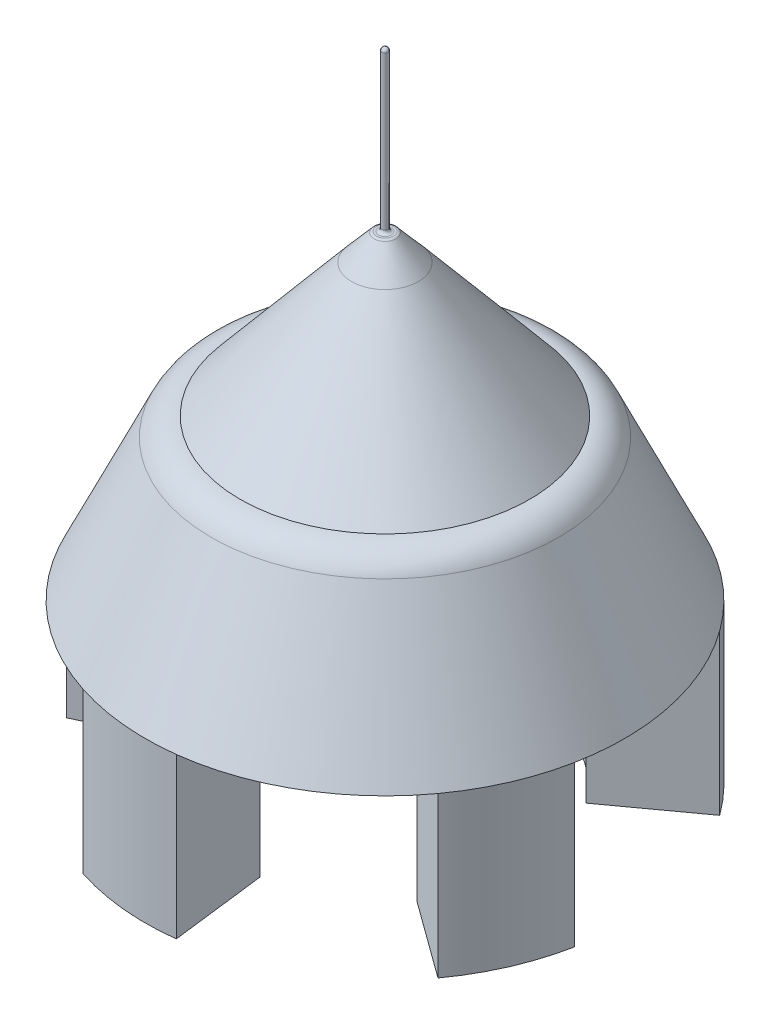
ISO-10303-21;
HEADER;
FILE_DESCRIPTION(('STEP AP214'),'2;1');
FILE_NAME('part.step','',(''),(''),'','','');
FILE_SCHEMA(('AUTOMOTIVE_DESIGN { 1 0 10303 214 1 1 1 1 }'));
ENDSEC;
DATA;
#1=APPLICATION_CONTEXT('core data for automotive mechanical design processes');
#2=APPLICATION_PROTOCOL_DEFINITION('international standard','automotive_design',2000,#1);
#3=PRODUCT_CONTEXT('',#1,'mechanical');
#4=PRODUCT('Part','Part','',(#3));
#5=PRODUCT_RELATED_PRODUCT_CATEGORY('part','',(#4));
#6=PRODUCT_DEFINITION_FORMATION('','',#4);
#7=PRODUCT_DEFINITION_CONTEXT('part definition',#1,'design');
#8=PRODUCT_DEFINITION('design','',#6,#7);
#9=PRODUCT_DEFINITION_SHAPE('','',#8);
#10=(LENGTH_UNIT() NAMED_UNIT(*) SI_UNIT(.MILLI.,.METRE.));
#11=(NAMED_UNIT(*) PLANE_ANGLE_UNIT() SI_UNIT($,.RADIAN.));
#12=(NAMED_UNIT(*) SI_UNIT($,.STERADIAN.) SOLID_ANGLE_UNIT());
#13=UNCERTAINTY_MEASURE_WITH_UNIT(LENGTH_MEASURE(1.E-05),#10,'distance_accuracy_value','');
#14=(GEOMETRIC_REPRESENTATION_CONTEXT(3) GLOBAL_UNCERTAINTY_ASSIGNED_CONTEXT((#13)) GLOBAL_UNIT_ASSIGNED_CONTEXT((#10,
#11,#12)) REPRESENTATION_CONTEXT('',''));
#15=CARTESIAN_POINT('',(0.,0.,0.));
#16=DIRECTION('',(0.,0.,1.));
#17=DIRECTION('',(1.,0.,0.));
#18=AXIS2_PLACEMENT_3D('',#15,#16,#17);
#19=CARTESIAN_POINT('',(0.,0.,0.));
#20=DIRECTION('',(0.,1.,0.));
#21=DIRECTION('',(0.,0.,1.));
#22=AXIS2_PLACEMENT_3D('',#19,#20,#21);
#23=PLANE('',#22);
#24=DIRECTION('',(0.309016994374958,0.,0.95105651629515));
#25=VECTOR('',#24,1.);
#26=CARTESIAN_POINT('',(-23.1762745781219,0.,-71.3292387221362));
#27=LINE('',#26,#25);
#28=CARTESIAN_POINT('',(-23.1762745781219,0.,-71.3292387221362));
#29=VERTEX_POINT('',#28);
#30=CARTESIAN_POINT('',(-13.9057647468731,0.,-42.7975432332817));
#31=VERTEX_POINT('',#30);
#32=EDGE_CURVE('E518',#29,#31,#27,.T.);
#33=ORIENTED_EDGE('',*,*,#32,.F.);
#34=CARTESIAN_POINT('',(0.,0.,0.));
#35=DIRECTION('',(0.,1.,0.));
#36=DIRECTION('',(0.,0.,1.));
#37=AXIS2_PLACEMENT_3D('',#34,#35,#36);
#38=CIRCLE('',#37,75.);
#39=CARTESIAN_POINT('',(36.3607215184746,0.,-65.596478035455));
#40=VERTEX_POINT('',#39);
#41=EDGE_CURVE('E510',#40,#29,#38,.T.);
#42=ORIENTED_EDGE('',*,*,#41,.F.);
#43=DIRECTION('',(0.484809620246328,0.,-0.874619707139401));
#44=VECTOR('',#43,1.);
#45=CARTESIAN_POINT('',(36.3607215184746,0.,-65.596478035455));
#46=LINE('',#45,#44);
#47=CARTESIAN_POINT('',(21.8164329110848,0.,-39.357886821273));
#48=VERTEX_POINT('',#47);
#49=EDGE_CURVE('E208',#48,#40,#46,.T.);
#50=ORIENTED_EDGE('',*,*,#49,.F.);
#51=CARTESIAN_POINT('',(0.,0.,0.));
#52=DIRECTION('',(0.,1.,0.));
#53=DIRECTION('',(0.58778525229248,0.,0.809016994374942));
#54=AXIS2_PLACEMENT_3D('',#51,#52,#53);
#55=CIRCLE('',#54,45.);
#56=CARTESIAN_POINT('',(36.4057647468724,0.,-26.4503363531616));
#57=VERTEX_POINT('',#56);
#58=EDGE_CURVE('E215',#57,#48,#55,.T.);
#59=ORIENTED_EDGE('',*,*,#58,.F.);
#60=DIRECTION('',(-0.809016994374942,0.,0.58778525229248));
#61=VECTOR('',#60,1.);
#62=CARTESIAN_POINT('',(60.6762745781206,0.,-44.083893921936));
#63=LINE('',#62,#61);
#64=CARTESIAN_POINT('',(60.6762745781206,0.,-44.083893921936));
#65=VERTEX_POINT('',#64);
#66=EDGE_CURVE('E198',#65,#57,#63,.T.);
#67=ORIENTED_EDGE('',*,*,#66,.F.);
#68=CARTESIAN_POINT('',(73.6220387585749,0.,14.3106746532404));
#69=VERTEX_POINT('',#68);
#70=EDGE_CURVE('E506',#69,#65,#38,.T.);
#71=ORIENTED_EDGE('',*,*,#70,.F.);
#72=DIRECTION('',(0.981627183447665,0.,0.190808995376538));
#73=VECTOR('',#72,1.);
#74=CARTESIAN_POINT('',(73.6220387585749,0.,14.3106746532404));
#75=LINE('',#74,#73);
#76=CARTESIAN_POINT('',(44.1732232551449,0.,8.5864047919442));
#77=VERTEX_POINT('',#76);
#78=EDGE_CURVE('E232',#77,#69,#75,.T.);
#79=ORIENTED_EDGE('',*,*,#78,.F.);
#80=CARTESIAN_POINT('',(0.,0.,0.));
#81=DIRECTION('',(0.,1.,0.));
#82=DIRECTION('',(-0.587785252292469,0.,0.809016994374951));
#83=AXIS2_PLACEMENT_3D('',#80,#81,#82);
#84=CIRCLE('',#83,45.);
#85=CARTESIAN_POINT('',(36.4057647468728,0.,26.4503363531611));
#86=VERTEX_POINT('',#85);
#87=EDGE_CURVE('E243',#86,#77,#84,.T.);
#88=ORIENTED_EDGE('',*,*,#87,.F.);
#89=DIRECTION('',(-0.809016994374951,0.,-0.587785252292469));
#90=VECTOR('',#89,1.);
#91=CARTESIAN_POINT('',(60.6762745781213,0.,44.0838939219351));
#92=LINE('',#91,#90);
#93=CARTESIAN_POINT('',(60.6762745781213,0.,44.0838939219351));
#94=VERTEX_POINT('',#93);
#95=EDGE_CURVE('E241',#94,#86,#92,.T.);
#96=ORIENTED_EDGE('',*,*,#95,.F.);
#97=CARTESIAN_POINT('',(9.14020075538635,0.,74.4409613730991));
#98=VERTEX_POINT('',#97);
#99=EDGE_CURVE('E504',#98,#94,#38,.T.);
#100=ORIENTED_EDGE('',*,*,#99,.F.);
#101=DIRECTION('',(0.121869343405151,0.,0.992546151641322));
#102=VECTOR('',#101,1.);
#103=CARTESIAN_POINT('',(9.14020075538635,0.,74.4409613730991));
#104=LINE('',#103,#102);
#105=CARTESIAN_POINT('',(5.48412045323183,0.,44.6645768238595));
#106=VERTEX_POINT('',#105);
#107=EDGE_CURVE('E261',#106,#98,#104,.T.);
#108=ORIENTED_EDGE('',*,*,#107,.F.);
#109=CARTESIAN_POINT('',(0.,0.,0.));
#110=DIRECTION('',(0.,1.,0.));
#111=DIRECTION('',(-0.951056516295155,0.,-0.309016994374945));
#112=AXIS2_PLACEMENT_3D('',#109,#110,#111);
#113=CIRCLE('',#112,45.);
#114=CARTESIAN_POINT('',(-13.9057647468725,0.,42.7975432332819));
#115=VERTEX_POINT('',#114);
#116=EDGE_CURVE('E272',#115,#106,#113,.T.);
#117=ORIENTED_EDGE('',*,*,#116,.F.);
#118=DIRECTION('',(0.309016994374945,0.,-0.951056516295155));
#119=VECTOR('',#118,1.);
#120=CARTESIAN_POINT('',(-23.1762745781209,0.,71.3292387221366));
#121=LINE('',#120,#119);
#122=CARTESIAN_POINT('',(-23.1762745781209,0.,71.3292387221366));
#123=VERTEX_POINT('',#122);
#124=EDGE_CURVE('E270',#123,#115,#121,.T.);
#125=ORIENTED_EDGE('',*,*,#124,.F.);
#126=CARTESIAN_POINT('',(-67.9730840277487,0.,31.6963696305525));
#127=VERTEX_POINT('',#126);
#128=EDGE_CURVE('E320',#127,#123,#38,.T.);
#129=ORIENTED_EDGE('',*,*,#128,.F.);
#130=DIRECTION('',(-0.906307787036649,0.,0.4226182617407));
#131=VECTOR('',#130,1.);
#132=CARTESIAN_POINT('',(-67.9730840277487,0.,31.6963696305525));
#133=LINE('',#132,#131);
#134=CARTESIAN_POINT('',(-40.7838504166492,0.,19.0178217783315));
#135=VERTEX_POINT('',#134);
#136=EDGE_CURVE('E290',#135,#127,#133,.T.);
#137=ORIENTED_EDGE('',*,*,#136,.F.);
#138=CARTESIAN_POINT('',(0.,0.,0.));
#139=DIRECTION('',(0.,1.,0.));
#140=DIRECTION('',(0.,0.,-1.));
#141=AXIS2_PLACEMENT_3D('',#138,#139,#140);
#142=CIRCLE('',#141,45.);
#143=CARTESIAN_POINT('',(-45.,0.,0.));
#144=VERTEX_POINT('',#143);
#145=EDGE_CURVE('E299',#144,#135,#142,.T.);
#146=ORIENTED_EDGE('',*,*,#145,.F.);
#147=DIRECTION('',(1.,0.,0.));
#148=VECTOR('',#147,1.);
#149=CARTESIAN_POINT('',(-75.,0.,0.));
#150=LINE('',#149,#148);
#151=CARTESIAN_POINT('',(-75.,0.,0.));
#152=VERTEX_POINT('',#151);
#153=EDGE_CURVE('E285',#152,#144,#150,.T.);
#154=ORIENTED_EDGE('',*,*,#153,.F.);
#155=CARTESIAN_POINT('',(-51.1498770046881,0.,-54.8515276214371));
#156=VERTEX_POINT('',#155);
#157=EDGE_CURVE('E315',#156,#152,#38,.T.);
#158=ORIENTED_EDGE('',*,*,#157,.F.);
#159=DIRECTION('',(-0.681998360062508,0.,-0.731353701619162));
#160=VECTOR('',#159,1.);
#161=CARTESIAN_POINT('',(-51.1498770046881,0.,-54.8515276214371));
#162=LINE('',#161,#160);
#163=CARTESIAN_POINT('',(-30.6899262028128,0.,-32.9109165728623));
#164=VERTEX_POINT('',#163);
#165=EDGE_CURVE('E190',#164,#156,#162,.T.);
#166=ORIENTED_EDGE('',*,*,#165,.F.);
#167=CARTESIAN_POINT('',(0.,0.,0.));
#168=DIRECTION('',(0.,1.,0.));
#169=DIRECTION('',(0.95105651629515,0.,-0.309016994374958));
#170=AXIS2_PLACEMENT_3D('',#167,#168,#169);
#171=CIRCLE('',#170,45.);
#172=EDGE_CURVE('E520',#31,#164,#171,.T.);
#173=ORIENTED_EDGE('',*,*,#172,.F.);
#174=EDGE_LOOP('',(#33,#42,#50,#59,#67,#71,#79,#88,#96,#100,#108,#117,#125,#129,#137,#146,#154,
#158,#166,#173));
#175=FACE_BOUND('',#174,.T.);
#176=ADVANCED_FACE('F35',(#175),#23,.F.);
#177=CARTESIAN_POINT('',(0.,0.,0.));
#178=DIRECTION('',(0.,-1.,0.));
#179=DIRECTION('',(0.,0.,1.));
#180=AXIS2_PLACEMENT_3D('',#177,#178,#179);
#181=CONICAL_SURFACE('',#180,75.,0.436332312998583);
#182=CARTESIAN_POINT('',(0.,44.226182617407,0.));
#183=DIRECTION('',(0.,-1.,0.));
#184=DIRECTION('',(0.,0.,-1.));
#185=AXIS2_PLACEMENT_3D('',#182,#183,#184);
#186=CIRCLE('',#185,54.3769923545416);
#187=CARTESIAN_POINT('',(0.,44.226182617407,-54.3769923545416));
#188=VERTEX_POINT('',#187);
#189=EDGE_CURVE('E323',#188,#188,#186,.T.);
#190=ORIENTED_EDGE('',*,*,#189,.T.);
#191=EDGE_LOOP('',(#190));
#192=FACE_BOUND('',#191,.T.);
#193=EDGE_CURVE('E316',#152,#127,#38,.T.);
#194=ORIENTED_EDGE('',*,*,#193,.T.);
#195=ORIENTED_EDGE('',*,*,#128,.T.);
#196=CARTESIAN_POINT('',(0.,0.,0.));
#197=DIRECTION('',(0.,-1.,0.));
#198=DIRECTION('',(-0.951056516295155,0.,-0.309016994374945));
#199=AXIS2_PLACEMENT_3D('',#196,#197,#198);
#200=CIRCLE('',#199,75.);
#201=EDGE_CURVE('E256',#98,#123,#200,.T.);
#202=ORIENTED_EDGE('',*,*,#201,.F.);
#203=ORIENTED_EDGE('',*,*,#99,.T.);
#204=CARTESIAN_POINT('',(0.,0.,0.));
#205=DIRECTION('',(0.,-1.,0.));
#206=DIRECTION('',(-0.587785252292469,0.,0.809016994374951));
#207=AXIS2_PLACEMENT_3D('',#204,#205,#206);
#208=CIRCLE('',#207,75.);
#209=EDGE_CURVE('E227',#69,#94,#208,.T.);
#210=ORIENTED_EDGE('',*,*,#209,.F.);
#211=ORIENTED_EDGE('',*,*,#70,.T.);
#212=CARTESIAN_POINT('',(0.,0.,0.));
#213=DIRECTION('',(0.,-1.,0.));
#214=DIRECTION('',(0.58778525229248,0.,0.809016994374942));
#215=AXIS2_PLACEMENT_3D('',#212,#213,#214);
#216=CIRCLE('',#215,75.);
#217=EDGE_CURVE('E196',#40,#65,#216,.T.);
#218=ORIENTED_EDGE('',*,*,#217,.F.);
#219=ORIENTED_EDGE('',*,*,#41,.T.);
#220=CARTESIAN_POINT('',(0.,0.,0.));
#221=DIRECTION('',(0.,-1.,0.));
#222=DIRECTION('',(0.95105651629515,0.,-0.309016994374958));
#223=AXIS2_PLACEMENT_3D('',#220,#221,#222);
#224=CIRCLE('',#223,75.);
#225=EDGE_CURVE('E194',#156,#29,#224,.T.);
#226=ORIENTED_EDGE('',*,*,#225,.F.);
#227=ORIENTED_EDGE('',*,*,#157,.T.);
#228=EDGE_LOOP('',(#194,#195,#202,#203,#210,#211,#218,#219,#226,#227));
#229=FACE_BOUND('',#228,.T.);
#230=ADVANCED_FACE('F353',(#192,#229),#181,.T.);
#231=CARTESIAN_POINT('',(0.,40.,0.));
#232=DIRECTION('',(0.,1.,0.));
#233=DIRECTION('',(0.,0.,1.));
#234=AXIS2_PLACEMENT_3D('',#231,#232,#233);
#235=TOROIDAL_SURFACE('',#234,45.3139144841751,10.);
#236=ORIENTED_EDGE('',*,*,#189,.F.);
#237=EDGE_LOOP('',(#236));
#238=FACE_BOUND('',#237,.T.);
#239=CARTESIAN_POINT('',(0.,50.,0.));
#240=DIRECTION('',(0.,1.,0.));
#241=DIRECTION('',(0.,0.,1.));
#242=AXIS2_PLACEMENT_3D('',#239,#240,#241);
#243=CIRCLE('',#242,45.3139144841751);
#244=CARTESIAN_POINT('',(0.,50.,45.3139144841751));
#245=VERTEX_POINT('',#244);
#246=EDGE_CURVE('E319',#245,#245,#243,.T.);
#247=ORIENTED_EDGE('',*,*,#246,.F.);
#248=EDGE_LOOP('',(#247));
#249=FACE_BOUND('',#248,.T.);
#250=ADVANCED_FACE('F359',(#238,#249),#235,.T.);
#251=CARTESIAN_POINT('',(0.,-50.,0.));
#252=DIRECTION('',(0.,1.,0.));
#253=DIRECTION('',(0.,0.,1.));
#254=AXIS2_PLACEMENT_3D('',#251,#252,#253);
#255=CYLINDRICAL_SURFACE('',#254,75.);
#256=ORIENTED_EDGE('',*,*,#193,.F.);
#257=DIRECTION('',(0.,1.,0.));
#258=VECTOR('',#257,1.);
#259=CARTESIAN_POINT('',(-75.,-50.,0.));
#260=LINE('',#259,#258);
#261=CARTESIAN_POINT('',(-75.,-50.,0.));
#262=VERTEX_POINT('',#261);
#263=EDGE_CURVE('E312',#262,#152,#260,.T.);
#264=ORIENTED_EDGE('',*,*,#263,.F.);
#265=CARTESIAN_POINT('',(0.,-50.,0.));
#266=DIRECTION('',(0.,-1.,0.));
#267=DIRECTION('',(0.,0.,-1.));
#268=AXIS2_PLACEMENT_3D('',#265,#266,#267);
#269=CIRCLE('',#268,75.);
#270=CARTESIAN_POINT('',(-67.9730840277487,-50.,31.6963696305525));
#271=VERTEX_POINT('',#270);
#272=EDGE_CURVE('E286',#271,#262,#269,.T.);
#273=ORIENTED_EDGE('',*,*,#272,.F.);
#274=DIRECTION('',(0.,1.,0.));
#275=VECTOR('',#274,1.);
#276=CARTESIAN_POINT('',(-67.9730840277487,-50.,31.6963696305525));
#277=LINE('',#276,#275);
#278=EDGE_CURVE('E296',#271,#127,#277,.T.);
#279=ORIENTED_EDGE('',*,*,#278,.T.);
#280=EDGE_LOOP('',(#256,#264,#273,#279));
#281=FACE_BOUND('',#280,.T.);
#282=ADVANCED_FACE('F363',(#281),#255,.T.);
#283=CARTESIAN_POINT('',(-75.,-50.,0.));
#284=DIRECTION('',(0.,0.,1.));
#285=DIRECTION('',(1.,0.,0.));
#286=AXIS2_PLACEMENT_3D('',#283,#284,#285);
#287=PLANE('',#286);
#288=ORIENTED_EDGE('',*,*,#153,.T.);
#289=DIRECTION('',(0.,1.,0.));
#290=VECTOR('',#289,1.);
#291=CARTESIAN_POINT('',(-45.,-50.,0.));
#292=LINE('',#291,#290);
#293=CARTESIAN_POINT('',(-45.,-50.,0.));
#294=VERTEX_POINT('',#293);
#295=EDGE_CURVE('E309',#294,#144,#292,.T.);
#296=ORIENTED_EDGE('',*,*,#295,.F.);
#297=DIRECTION('',(1.,0.,0.));
#298=VECTOR('',#297,1.);
#299=CARTESIAN_POINT('',(-75.,-50.,0.));
#300=LINE('',#299,#298);
#301=EDGE_CURVE('E289',#262,#294,#300,.T.);
#302=ORIENTED_EDGE('',*,*,#301,.F.);
#303=ORIENTED_EDGE('',*,*,#263,.T.);
#304=EDGE_LOOP('',(#288,#296,#302,#303));
#305=FACE_BOUND('',#304,.T.);
#306=ADVANCED_FACE('F481',(#305),#287,.F.);
#307=CARTESIAN_POINT('',(0.,-50.,0.));
#308=DIRECTION('',(0.,1.,0.));
#309=DIRECTION('',(0.,0.,1.));
#310=AXIS2_PLACEMENT_3D('',#307,#308,#309);
#311=CYLINDRICAL_SURFACE('',#310,45.);
#312=ORIENTED_EDGE('',*,*,#145,.T.);
#313=DIRECTION('',(0.,1.,0.));
#314=VECTOR('',#313,1.);
#315=CARTESIAN_POINT('',(-40.7838504166492,-50.,19.0178217783315));
#316=LINE('',#315,#314);
#317=CARTESIAN_POINT('',(-40.7838504166492,-50.,19.0178217783315));
#318=VERTEX_POINT('',#317);
#319=EDGE_CURVE('E306',#318,#135,#316,.T.);
#320=ORIENTED_EDGE('',*,*,#319,.F.);
#321=CARTESIAN_POINT('',(0.,-50.,0.));
#322=DIRECTION('',(0.,1.,0.));
#323=DIRECTION('',(0.,0.,-1.));
#324=AXIS2_PLACEMENT_3D('',#321,#322,#323);
#325=CIRCLE('',#324,45.);
#326=EDGE_CURVE('E292',#294,#318,#325,.T.);
#327=ORIENTED_EDGE('',*,*,#326,.F.);
#328=ORIENTED_EDGE('',*,*,#295,.T.);
#329=EDGE_LOOP('',(#312,#320,#327,#328));
#330=FACE_BOUND('',#329,.T.);
#331=ADVANCED_FACE('F478',(#330),#311,.F.);
#332=CARTESIAN_POINT('',(-67.9730840277487,-50.,31.6963696305525));
#333=DIRECTION('',(-0.4226182617407,0.,-0.90630778703665));
#334=DIRECTION('',(-0.90630778703665,0.,0.4226182617407));
#335=AXIS2_PLACEMENT_3D('',#332,#333,#334);
#336=PLANE('',#335);
#337=ORIENTED_EDGE('',*,*,#136,.T.);
#338=ORIENTED_EDGE('',*,*,#278,.F.);
#339=DIRECTION('',(-0.906307787036649,0.,0.4226182617407));
#340=VECTOR('',#339,1.);
#341=CARTESIAN_POINT('',(-67.9730840277487,-50.,31.6963696305525));
#342=LINE('',#341,#340);
#343=EDGE_CURVE('E294',#318,#271,#342,.T.);
#344=ORIENTED_EDGE('',*,*,#343,.F.);
#345=ORIENTED_EDGE('',*,*,#319,.T.);
#346=EDGE_LOOP('',(#337,#338,#344,#345));
#347=FACE_BOUND('',#346,.T.);
#348=ADVANCED_FACE('F474',(#347),#336,.F.);
#349=CARTESIAN_POINT('',(0.,-50.,0.));
#350=DIRECTION('',(0.,-1.,0.));
#351=DIRECTION('',(0.,0.,-1.));
#352=AXIS2_PLACEMENT_3D('',#349,#350,#351);
#353=PLANE('',#352);
#354=ORIENTED_EDGE('',*,*,#272,.T.);
#355=ORIENTED_EDGE('',*,*,#301,.T.);
#356=ORIENTED_EDGE('',*,*,#326,.T.);
#357=ORIENTED_EDGE('',*,*,#343,.T.);
#358=EDGE_LOOP('',(#354,#355,#356,#357));
#359=FACE_BOUND('',#358,.T.);
#360=ADVANCED_FACE('F470',(#359),#353,.T.);
#361=CARTESIAN_POINT('',(0.,-50.,0.));
#362=DIRECTION('',(0.,1.,0.));
#363=DIRECTION('',(0.,0.,1.));
#364=AXIS2_PLACEMENT_3D('',#361,#362,#363);
#365=CYLINDRICAL_SURFACE('',#364,75.);
#366=ORIENTED_EDGE('',*,*,#201,.T.);
#367=DIRECTION('',(0.,1.,0.));
#368=VECTOR('',#367,1.);
#369=CARTESIAN_POINT('',(-23.1762745781209,-50.,71.3292387221366));
#370=LINE('',#369,#368);
#371=CARTESIAN_POINT('',(-23.1762745781209,-50.,71.3292387221366));
#372=VERTEX_POINT('',#371);
#373=EDGE_CURVE('E283',#372,#123,#370,.T.);
#374=ORIENTED_EDGE('',*,*,#373,.F.);
#375=CARTESIAN_POINT('',(0.,-50.,0.));
#376=DIRECTION('',(0.,-1.,0.));
#377=DIRECTION('',(-0.951056516295155,0.,-0.309016994374945));
#378=AXIS2_PLACEMENT_3D('',#375,#376,#377);
#379=CIRCLE('',#378,75.);
#380=CARTESIAN_POINT('',(9.14020075538635,-50.,74.4409613730991));
#381=VERTEX_POINT('',#380);
#382=EDGE_CURVE('E257',#381,#372,#379,.T.);
#383=ORIENTED_EDGE('',*,*,#382,.F.);
#384=DIRECTION('',(0.,1.,0.));
#385=VECTOR('',#384,1.);
#386=CARTESIAN_POINT('',(9.14020075538635,-50.,74.4409613730991));
#387=LINE('',#386,#385);
#388=EDGE_CURVE('E267',#381,#98,#387,.T.);
#389=ORIENTED_EDGE('',*,*,#388,.T.);
#390=EDGE_LOOP('',(#366,#374,#383,#389));
#391=FACE_BOUND('',#390,.T.);
#392=ADVANCED_FACE('F466',(#391),#365,.T.);
#393=CARTESIAN_POINT('',(-23.1762745781209,-50.,71.3292387221366));
#394=DIRECTION('',(0.951056516295155,0.,0.309016994374945));
#395=DIRECTION('',(0.309016994374945,0.,-0.951056516295155));
#396=AXIS2_PLACEMENT_3D('',#393,#394,#395);
#397=PLANE('',#396);
#398=ORIENTED_EDGE('',*,*,#124,.T.);
#399=DIRECTION('',(0.,1.,0.));
#400=VECTOR('',#399,1.);
#401=CARTESIAN_POINT('',(-13.9057647468725,-50.,42.7975432332819));
#402=LINE('',#401,#400);
#403=CARTESIAN_POINT('',(-13.9057647468725,-50.,42.7975432332819));
#404=VERTEX_POINT('',#403);
#405=EDGE_CURVE('E280',#404,#115,#402,.T.);
#406=ORIENTED_EDGE('',*,*,#405,.F.);
#407=DIRECTION('',(0.309016994374945,0.,-0.951056516295155));
#408=VECTOR('',#407,1.);
#409=CARTESIAN_POINT('',(-23.1762745781209,-50.,71.3292387221366));
#410=LINE('',#409,#408);
#411=EDGE_CURVE('E260',#372,#404,#410,.T.);
#412=ORIENTED_EDGE('',*,*,#411,.F.);
#413=ORIENTED_EDGE('',*,*,#373,.T.);
#414=EDGE_LOOP('',(#398,#406,#412,#413));
#415=FACE_BOUND('',#414,.T.);
#416=ADVANCED_FACE('F462',(#415),#397,.F.);
#417=CARTESIAN_POINT('',(0.,-50.,0.));
#418=DIRECTION('',(0.,1.,0.));
#419=DIRECTION('',(0.,0.,1.));
#420=AXIS2_PLACEMENT_3D('',#417,#418,#419);
#421=CYLINDRICAL_SURFACE('',#420,45.);
#422=ORIENTED_EDGE('',*,*,#116,.T.);
#423=DIRECTION('',(0.,1.,0.));
#424=VECTOR('',#423,1.);
#425=CARTESIAN_POINT('',(5.48412045323183,-50.,44.6645768238595));
#426=LINE('',#425,#424);
#427=CARTESIAN_POINT('',(5.48412045323183,-50.,44.6645768238595));
#428=VERTEX_POINT('',#427);
#429=EDGE_CURVE('E277',#428,#106,#426,.T.);
#430=ORIENTED_EDGE('',*,*,#429,.F.);
#431=CARTESIAN_POINT('',(0.,-50.,0.));
#432=DIRECTION('',(0.,1.,0.));
#433=DIRECTION('',(-0.951056516295155,0.,-0.309016994374945));
#434=AXIS2_PLACEMENT_3D('',#431,#432,#433);
#435=CIRCLE('',#434,45.);
#436=EDGE_CURVE('E263',#404,#428,#435,.T.);
#437=ORIENTED_EDGE('',*,*,#436,.F.);
#438=ORIENTED_EDGE('',*,*,#405,.T.);
#439=EDGE_LOOP('',(#422,#430,#437,#438));
#440=FACE_BOUND('',#439,.T.);
#441=ADVANCED_FACE('F458',(#440),#421,.F.);
#442=CARTESIAN_POINT('',(9.14020075538635,-50.,74.4409613730991));
#443=DIRECTION('',(-0.992546151641321,0.,0.121869343405151));
#444=DIRECTION('',(0.121869343405151,0.,0.992546151641322));
#445=AXIS2_PLACEMENT_3D('',#442,#443,#444);
#446=PLANE('',#445);
#447=ORIENTED_EDGE('',*,*,#107,.T.);
#448=ORIENTED_EDGE('',*,*,#388,.F.);
#449=DIRECTION('',(0.121869343405151,0.,0.992546151641322));
#450=VECTOR('',#449,1.);
#451=CARTESIAN_POINT('',(9.14020075538635,-50.,74.4409613730991));
#452=LINE('',#451,#450);
#453=EDGE_CURVE('E265',#428,#381,#452,.T.);
#454=ORIENTED_EDGE('',*,*,#453,.F.);
#455=ORIENTED_EDGE('',*,*,#429,.T.);
#456=EDGE_LOOP('',(#447,#448,#454,#455));
#457=FACE_BOUND('',#456,.T.);
#458=ADVANCED_FACE('F454',(#457),#446,.F.);
#459=CARTESIAN_POINT('',(0.,-50.,0.));
#460=DIRECTION('',(0.,-1.,0.));
#461=DIRECTION('',(-0.951056516295155,0.,-0.309016994374945));
#462=AXIS2_PLACEMENT_3D('',#459,#460,#461);
#463=PLANE('',#462);
#464=ORIENTED_EDGE('',*,*,#382,.T.);
#465=ORIENTED_EDGE('',*,*,#411,.T.);
#466=ORIENTED_EDGE('',*,*,#436,.T.);
#467=ORIENTED_EDGE('',*,*,#453,.T.);
#468=EDGE_LOOP('',(#464,#465,#466,#467));
#469=FACE_BOUND('',#468,.T.);
#470=ADVANCED_FACE('F450',(#469),#463,.T.);
#471=CARTESIAN_POINT('',(0.,-50.,0.));
#472=DIRECTION('',(0.,1.,0.));
#473=DIRECTION('',(0.,0.,1.));
#474=AXIS2_PLACEMENT_3D('',#471,#472,#473);
#475=CYLINDRICAL_SURFACE('',#474,75.);
#476=ORIENTED_EDGE('',*,*,#209,.T.);
#477=DIRECTION('',(0.,1.,0.));
#478=VECTOR('',#477,1.);
#479=CARTESIAN_POINT('',(60.6762745781213,-50.,44.0838939219351));
#480=LINE('',#479,#478);
#481=CARTESIAN_POINT('',(60.6762745781213,-50.,44.0838939219351));
#482=VERTEX_POINT('',#481);
#483=EDGE_CURVE('E254',#482,#94,#480,.T.);
#484=ORIENTED_EDGE('',*,*,#483,.F.);
#485=CARTESIAN_POINT('',(0.,-50.,0.));
#486=DIRECTION('',(0.,-1.,0.));
#487=DIRECTION('',(-0.587785252292469,0.,0.809016994374951));
#488=AXIS2_PLACEMENT_3D('',#485,#486,#487);
#489=CIRCLE('',#488,75.);
#490=CARTESIAN_POINT('',(73.6220387585749,-50.,14.3106746532404));
#491=VERTEX_POINT('',#490);
#492=EDGE_CURVE('E228',#491,#482,#489,.T.);
#493=ORIENTED_EDGE('',*,*,#492,.F.);
#494=DIRECTION('',(0.,1.,0.));
#495=VECTOR('',#494,1.);
#496=CARTESIAN_POINT('',(73.6220387585749,-50.,14.3106746532404));
#497=LINE('',#496,#495);
#498=EDGE_CURVE('E238',#491,#69,#497,.T.);
#499=ORIENTED_EDGE('',*,*,#498,.T.);
#500=EDGE_LOOP('',(#476,#484,#493,#499));
#501=FACE_BOUND('',#500,.T.);
#502=ADVANCED_FACE('F446',(#501),#475,.T.);
#503=CARTESIAN_POINT('',(60.6762745781213,-50.,44.0838939219351));
#504=DIRECTION('',(0.587785252292469,0.,-0.809016994374951));
#505=DIRECTION('',(-0.809016994374951,0.,-0.587785252292469));
#506=AXIS2_PLACEMENT_3D('',#503,#504,#505);
#507=PLANE('',#506);
#508=ORIENTED_EDGE('',*,*,#95,.T.);
#509=DIRECTION('',(0.,1.,0.));
#510=VECTOR('',#509,1.);
#511=CARTESIAN_POINT('',(36.4057647468728,-50.,26.4503363531611));
#512=LINE('',#511,#510);
#513=CARTESIAN_POINT('',(36.4057647468728,-50.,26.4503363531611));
#514=VERTEX_POINT('',#513);
#515=EDGE_CURVE('E251',#514,#86,#512,.T.);
#516=ORIENTED_EDGE('',*,*,#515,.F.);
#517=DIRECTION('',(-0.809016994374951,0.,-0.587785252292469));
#518=VECTOR('',#517,1.);
#519=CARTESIAN_POINT('',(60.6762745781213,-50.,44.0838939219351));
#520=LINE('',#519,#518);
#521=EDGE_CURVE('E231',#482,#514,#520,.T.);
#522=ORIENTED_EDGE('',*,*,#521,.F.);
#523=ORIENTED_EDGE('',*,*,#483,.T.);
#524=EDGE_LOOP('',(#508,#516,#522,#523));
#525=FACE_BOUND('',#524,.T.);
#526=ADVANCED_FACE('F442',(#525),#507,.F.);
#527=CARTESIAN_POINT('',(0.,-50.,0.));
#528=DIRECTION('',(0.,1.,0.));
#529=DIRECTION('',(0.,0.,1.));
#530=AXIS2_PLACEMENT_3D('',#527,#528,#529);
#531=CYLINDRICAL_SURFACE('',#530,45.);
#532=ORIENTED_EDGE('',*,*,#87,.T.);
#533=DIRECTION('',(0.,1.,0.));
#534=VECTOR('',#533,1.);
#535=CARTESIAN_POINT('',(44.1732232551449,-50.,8.5864047919442));
#536=LINE('',#535,#534);
#537=CARTESIAN_POINT('',(44.1732232551449,-50.,8.5864047919442));
#538=VERTEX_POINT('',#537);
#539=EDGE_CURVE('E248',#538,#77,#536,.T.);
#540=ORIENTED_EDGE('',*,*,#539,.F.);
#541=CARTESIAN_POINT('',(0.,-50.,0.));
#542=DIRECTION('',(0.,1.,0.));
#543=DIRECTION('',(-0.587785252292469,0.,0.809016994374951));
#544=AXIS2_PLACEMENT_3D('',#541,#542,#543);
#545=CIRCLE('',#544,45.);
#546=EDGE_CURVE('E234',#514,#538,#545,.T.);
#547=ORIENTED_EDGE('',*,*,#546,.F.);
#548=ORIENTED_EDGE('',*,*,#515,.T.);
#549=EDGE_LOOP('',(#532,#540,#547,#548));
#550=FACE_BOUND('',#549,.T.);
#551=ADVANCED_FACE('F438',(#550),#531,.F.);
#552=CARTESIAN_POINT('',(73.6220387585749,-50.,14.3106746532404));
#553=DIRECTION('',(-0.190808995376538,0.,0.981627183447665));
#554=DIRECTION('',(0.981627183447665,0.,0.190808995376538));
#555=AXIS2_PLACEMENT_3D('',#552,#553,#554);
#556=PLANE('',#555);
#557=ORIENTED_EDGE('',*,*,#78,.T.);
#558=ORIENTED_EDGE('',*,*,#498,.F.);
#559=DIRECTION('',(0.981627183447665,0.,0.190808995376538));
#560=VECTOR('',#559,1.);
#561=CARTESIAN_POINT('',(73.6220387585749,-50.,14.3106746532404));
#562=LINE('',#561,#560);
#563=EDGE_CURVE('E236',#538,#491,#562,.T.);
#564=ORIENTED_EDGE('',*,*,#563,.F.);
#565=ORIENTED_EDGE('',*,*,#539,.T.);
#566=EDGE_LOOP('',(#557,#558,#564,#565));
#567=FACE_BOUND('',#566,.T.);
#568=ADVANCED_FACE('F434',(#567),#556,.F.);
#569=CARTESIAN_POINT('',(0.,-50.,0.));
#570=DIRECTION('',(0.,-1.,0.));
#571=DIRECTION('',(-0.587785252292469,0.,0.809016994374951));
#572=AXIS2_PLACEMENT_3D('',#569,#570,#571);
#573=PLANE('',#572);
#574=ORIENTED_EDGE('',*,*,#492,.T.);
#575=ORIENTED_EDGE('',*,*,#521,.T.);
#576=ORIENTED_EDGE('',*,*,#546,.T.);
#577=ORIENTED_EDGE('',*,*,#563,.T.);
#578=EDGE_LOOP('',(#574,#575,#576,#577));
#579=FACE_BOUND('',#578,.T.);
#580=ADVANCED_FACE('F431',(#579),#573,.T.);
#581=CARTESIAN_POINT('',(0.,-50.,0.));
#582=DIRECTION('',(0.,1.,0.));
#583=DIRECTION('',(0.,0.,1.));
#584=AXIS2_PLACEMENT_3D('',#581,#582,#583);
#585=CYLINDRICAL_SURFACE('',#584,75.);
#586=ORIENTED_EDGE('',*,*,#217,.T.);
#587=DIRECTION('',(0.,1.,0.));
#588=VECTOR('',#587,1.);
#589=CARTESIAN_POINT('',(60.6762745781206,-50.,-44.083893921936));
#590=LINE('',#589,#588);
#591=CARTESIAN_POINT('',(60.6762745781206,-50.,-44.083893921936));
#592=VERTEX_POINT('',#591);
#593=EDGE_CURVE('E225',#592,#65,#590,.T.);
#594=ORIENTED_EDGE('',*,*,#593,.F.);
#595=CARTESIAN_POINT('',(0.,-50.,0.));
#596=DIRECTION('',(0.,-1.,0.));
#597=DIRECTION('',(0.58778525229248,0.,0.809016994374942));
#598=AXIS2_PLACEMENT_3D('',#595,#596,#597);
#599=CIRCLE('',#598,75.);
#600=CARTESIAN_POINT('',(36.3607215184746,-50.,-65.596478035455));
#601=VERTEX_POINT('',#600);
#602=EDGE_CURVE('E204',#601,#592,#599,.T.);
#603=ORIENTED_EDGE('',*,*,#602,.F.);
#604=DIRECTION('',(0.,1.,0.));
#605=VECTOR('',#604,1.);
#606=CARTESIAN_POINT('',(36.3607215184746,-50.,-65.596478035455));
#607=LINE('',#606,#605);
#608=EDGE_CURVE('E58',#601,#40,#607,.T.);
#609=ORIENTED_EDGE('',*,*,#608,.T.);
#610=EDGE_LOOP('',(#586,#594,#603,#609));
#611=FACE_BOUND('',#610,.T.);
#612=ADVANCED_FACE('F427',(#611),#585,.T.);
#613=CARTESIAN_POINT('',(60.6762745781206,-50.,-44.083893921936));
#614=DIRECTION('',(-0.58778525229248,0.,-0.809016994374942));
#615=DIRECTION('',(-0.809016994374942,0.,0.58778525229248));
#616=AXIS2_PLACEMENT_3D('',#613,#614,#615);
#617=PLANE('',#616);
#618=ORIENTED_EDGE('',*,*,#66,.T.);
#619=DIRECTION('',(0.,1.,0.));
#620=VECTOR('',#619,1.);
#621=CARTESIAN_POINT('',(36.4057647468724,-50.,-26.4503363531616));
#622=LINE('',#621,#620);
#623=CARTESIAN_POINT('',(36.4057647468724,-50.,-26.4503363531616));
#624=VERTEX_POINT('',#623);
#625=EDGE_CURVE('E222',#624,#57,#622,.T.);
#626=ORIENTED_EDGE('',*,*,#625,.F.);
#627=DIRECTION('',(-0.809016994374942,0.,0.58778525229248));
#628=VECTOR('',#627,1.);
#629=CARTESIAN_POINT('',(60.6762745781206,-50.,-44.083893921936));
#630=LINE('',#629,#628);
#631=EDGE_CURVE('E207',#592,#624,#630,.T.);
#632=ORIENTED_EDGE('',*,*,#631,.F.);
#633=ORIENTED_EDGE('',*,*,#593,.T.);
#634=EDGE_LOOP('',(#618,#626,#632,#633));
#635=FACE_BOUND('',#634,.T.);
#636=ADVANCED_FACE('F423',(#635),#617,.F.);
#637=CARTESIAN_POINT('',(0.,-50.,0.));
#638=DIRECTION('',(0.,1.,0.));
#639=DIRECTION('',(0.,0.,1.));
#640=AXIS2_PLACEMENT_3D('',#637,#638,#639);
#641=CYLINDRICAL_SURFACE('',#640,45.);
#642=ORIENTED_EDGE('',*,*,#58,.T.);
#643=DIRECTION('',(0.,1.,0.));
#644=VECTOR('',#643,1.);
#645=CARTESIAN_POINT('',(21.8164329110848,-50.,-39.357886821273));
#646=LINE('',#645,#644);
#647=CARTESIAN_POINT('',(21.8164329110848,-50.,-39.357886821273));
#648=VERTEX_POINT('',#647);
#649=EDGE_CURVE('E219',#648,#48,#646,.T.);
#650=ORIENTED_EDGE('',*,*,#649,.F.);
#651=CARTESIAN_POINT('',(0.,-50.,0.));
#652=DIRECTION('',(0.,1.,0.));
#653=DIRECTION('',(0.58778525229248,0.,0.809016994374942));
#654=AXIS2_PLACEMENT_3D('',#651,#652,#653);
#655=CIRCLE('',#654,45.);
#656=EDGE_CURVE('E210',#624,#648,#655,.T.);
#657=ORIENTED_EDGE('',*,*,#656,.F.);
#658=ORIENTED_EDGE('',*,*,#625,.T.);
#659=EDGE_LOOP('',(#642,#650,#657,#658));
#660=FACE_BOUND('',#659,.T.);
#661=ADVANCED_FACE('F419',(#660),#641,.F.);
#662=CARTESIAN_POINT('',(36.3607215184746,-50.,-65.596478035455));
#663=DIRECTION('',(0.874619707139401,0.,0.484809620246328));
#664=DIRECTION('',(0.484809620246328,0.,-0.874619707139401));
#665=AXIS2_PLACEMENT_3D('',#662,#663,#664);
#666=PLANE('',#665);
#667=ORIENTED_EDGE('',*,*,#49,.T.);
#668=ORIENTED_EDGE('',*,*,#608,.F.);
#669=DIRECTION('',(0.484809620246328,0.,-0.874619707139401));
#670=VECTOR('',#669,1.);
#671=CARTESIAN_POINT('',(36.3607215184746,-50.,-65.596478035455));
#672=LINE('',#671,#670);
#673=EDGE_CURVE('E212',#648,#601,#672,.T.);
#674=ORIENTED_EDGE('',*,*,#673,.F.);
#675=ORIENTED_EDGE('',*,*,#649,.T.);
#676=EDGE_LOOP('',(#667,#668,#674,#675));
#677=FACE_BOUND('',#676,.T.);
#678=ADVANCED_FACE('F415',(#677),#666,.F.);
#679=CARTESIAN_POINT('',(0.,-50.,0.));
#680=DIRECTION('',(0.,-1.,0.));
#681=DIRECTION('',(0.58778525229248,0.,0.809016994374942));
#682=AXIS2_PLACEMENT_3D('',#679,#680,#681);
#683=PLANE('',#682);
#684=ORIENTED_EDGE('',*,*,#602,.T.);
#685=ORIENTED_EDGE('',*,*,#631,.T.);
#686=ORIENTED_EDGE('',*,*,#656,.T.);
#687=ORIENTED_EDGE('',*,*,#673,.T.);
#688=EDGE_LOOP('',(#684,#685,#686,#687));
#689=FACE_BOUND('',#688,.T.);
#690=ADVANCED_FACE('F412',(#689),#683,.T.);
#691=CARTESIAN_POINT('',(0.,-50.,0.));
#692=DIRECTION('',(0.,1.,0.));
#693=DIRECTION('',(0.,0.,1.));
#694=AXIS2_PLACEMENT_3D('',#691,#692,#693);
#695=CYLINDRICAL_SURFACE('',#694,75.);
#696=ORIENTED_EDGE('',*,*,#225,.T.);
#697=DIRECTION('',(0.,1.,0.));
#698=VECTOR('',#697,1.);
#699=CARTESIAN_POINT('',(-23.1762745781219,-50.,-71.3292387221362));
#700=LINE('',#699,#698);
#701=CARTESIAN_POINT('',(-23.1762745781219,-50.,-71.3292387221362));
#702=VERTEX_POINT('',#701);
#703=EDGE_CURVE('E179',#702,#29,#700,.T.);
#704=ORIENTED_EDGE('',*,*,#703,.F.);
#705=CARTESIAN_POINT('',(0.,-50.,0.));
#706=DIRECTION('',(0.,-1.,0.));
#707=DIRECTION('',(0.95105651629515,0.,-0.309016994374958));
#708=AXIS2_PLACEMENT_3D('',#705,#706,#707);
#709=CIRCLE('',#708,75.);
#710=CARTESIAN_POINT('',(-51.1498770046881,-50.,-54.8515276214371));
#711=VERTEX_POINT('',#710);
#712=EDGE_CURVE('E185',#711,#702,#709,.T.);
#713=ORIENTED_EDGE('',*,*,#712,.F.);
#714=DIRECTION('',(0.,1.,0.));
#715=VECTOR('',#714,1.);
#716=CARTESIAN_POINT('',(-51.1498770046881,-50.,-54.8515276214371));
#717=LINE('',#716,#715);
#718=EDGE_CURVE('E50',#711,#156,#717,.T.);
#719=ORIENTED_EDGE('',*,*,#718,.T.);
#720=EDGE_LOOP('',(#696,#704,#713,#719));
#721=FACE_BOUND('',#720,.T.);
#722=ADVANCED_FACE('F192',(#721),#695,.T.);
#723=CARTESIAN_POINT('',(-23.1762745781219,-50.,-71.3292387221362));
#724=DIRECTION('',(-0.95105651629515,0.,0.309016994374958));
#725=DIRECTION('',(0.309016994374958,0.,0.95105651629515));
#726=AXIS2_PLACEMENT_3D('',#723,#724,#725);
#727=PLANE('',#726);
#728=ORIENTED_EDGE('',*,*,#32,.T.);
#729=DIRECTION('',(0.,1.,0.));
#730=VECTOR('',#729,1.);
#731=CARTESIAN_POINT('',(-13.9057647468731,-50.,-42.7975432332817));
#732=LINE('',#731,#730);
#733=CARTESIAN_POINT('',(-13.9057647468731,-50.,-42.7975432332817));
#734=VERTEX_POINT('',#733);
#735=EDGE_CURVE('E181',#734,#31,#732,.T.);
#736=ORIENTED_EDGE('',*,*,#735,.F.);
#737=DIRECTION('',(0.309016994374958,0.,0.95105651629515));
#738=VECTOR('',#737,1.);
#739=CARTESIAN_POINT('',(-23.1762745781219,-50.,-71.3292387221362));
#740=LINE('',#739,#738);
#741=EDGE_CURVE('E175',#702,#734,#740,.T.);
#742=ORIENTED_EDGE('',*,*,#741,.F.);
#743=ORIENTED_EDGE('',*,*,#703,.T.);
#744=EDGE_LOOP('',(#728,#736,#742,#743));
#745=FACE_BOUND('',#744,.T.);
#746=ADVANCED_FACE('F177',(#745),#727,.F.);
#747=CARTESIAN_POINT('',(0.,-50.,0.));
#748=DIRECTION('',(0.,1.,0.));
#749=DIRECTION('',(0.,0.,1.));
#750=AXIS2_PLACEMENT_3D('',#747,#748,#749);
#751=CYLINDRICAL_SURFACE('',#750,45.);
#752=ORIENTED_EDGE('',*,*,#172,.T.);
#753=DIRECTION('',(0.,1.,0.));
#754=VECTOR('',#753,1.);
#755=CARTESIAN_POINT('',(-30.6899262028128,-50.,-32.9109165728623));
#756=LINE('',#755,#754);
#757=CARTESIAN_POINT('',(-30.6899262028128,-50.,-32.9109165728623));
#758=VERTEX_POINT('',#757);
#759=EDGE_CURVE('E200',#758,#164,#756,.T.);
#760=ORIENTED_EDGE('',*,*,#759,.F.);
#761=CARTESIAN_POINT('',(0.,-50.,0.));
#762=DIRECTION('',(0.,1.,0.));
#763=DIRECTION('',(0.95105651629515,0.,-0.309016994374958));
#764=AXIS2_PLACEMENT_3D('',#761,#762,#763);
#765=CIRCLE('',#764,45.);
#766=EDGE_CURVE('E184',#734,#758,#765,.T.);
#767=ORIENTED_EDGE('',*,*,#766,.F.);
#768=ORIENTED_EDGE('',*,*,#735,.T.);
#769=EDGE_LOOP('',(#752,#760,#767,#768));
#770=FACE_BOUND('',#769,.T.);
#771=ADVANCED_FACE('F403',(#770),#751,.F.);
#772=CARTESIAN_POINT('',(-51.1498770046881,-50.,-54.8515276214371));
#773=DIRECTION('',(0.731353701619162,0.,-0.681998360062508));
#774=DIRECTION('',(-0.681998360062508,0.,-0.731353701619162));
#775=AXIS2_PLACEMENT_3D('',#772,#773,#774);
#776=PLANE('',#775);
#777=ORIENTED_EDGE('',*,*,#165,.T.);
#778=ORIENTED_EDGE('',*,*,#718,.F.);
#779=DIRECTION('',(-0.681998360062508,0.,-0.731353701619162));
#780=VECTOR('',#779,1.);
#781=CARTESIAN_POINT('',(-51.1498770046881,-50.,-54.8515276214371));
#782=LINE('',#781,#780);
#783=EDGE_CURVE('E189',#758,#711,#782,.T.);
#784=ORIENTED_EDGE('',*,*,#783,.F.);
#785=ORIENTED_EDGE('',*,*,#759,.T.);
#786=EDGE_LOOP('',(#777,#778,#784,#785));
#787=FACE_BOUND('',#786,.T.);
#788=ADVANCED_FACE('F397',(#787),#776,.F.);
#789=CARTESIAN_POINT('',(0.,-50.,0.));
#790=DIRECTION('',(0.,-1.,0.));
#791=DIRECTION('',(0.95105651629515,0.,-0.309016994374958));
#792=AXIS2_PLACEMENT_3D('',#789,#790,#791);
#793=PLANE('',#792);
#794=ORIENTED_EDGE('',*,*,#712,.T.);
#795=ORIENTED_EDGE('',*,*,#741,.T.);
#796=ORIENTED_EDGE('',*,*,#766,.T.);
#797=ORIENTED_EDGE('',*,*,#783,.T.);
#798=EDGE_LOOP('',(#794,#795,#796,#797));
#799=FACE_BOUND('',#798,.T.);
#800=ADVANCED_FACE('F187',(#799),#793,.T.);
#801=CARTESIAN_POINT('',(0.,50.,0.));
#802=DIRECTION('',(0.,-1.,0.));
#803=DIRECTION('',(0.,0.,1.));
#804=AXIS2_PLACEMENT_3D('',#801,#802,#803);
#805=CONICAL_SURFACE('',#804,45.3139144841751,0.698131700797733);
#806=CARTESIAN_POINT('',(0.,91.5735111256812,0.));
#807=DIRECTION('',(0.,-1.,0.));
#808=DIRECTION('',(0.,0.,-1.));
#809=AXIS2_PLACEMENT_3D('',#806,#807,#808);
#810=CIRCLE('',#809,10.4295966318713);
#811=CARTESIAN_POINT('',(0.,91.5735111256812,10.4295966318713));
#812=VERTEX_POINT('',#811);
#813=EDGE_CURVE('E329',#812,#812,#810,.T.);
#814=CARTESIAN_POINT('',(0.,91.5735111256812,10.4295966318713));
#815=CARTESIAN_POINT('',(0.,91.140453718122,10.7929749428328));
#816=CARTESIAN_POINT('',(0.,90.7073963105628,11.1563532537943));
#817=CARTESIAN_POINT('',(0.,89.8412814954445,11.8831098757173));
#818=CARTESIAN_POINT('',(0.,89.4082240878853,12.2464881866788));
#819=CARTESIAN_POINT('',(0.,88.5421092727669,12.9732448086018));
#820=CARTESIAN_POINT('',(0.,88.1090518652078,13.3366231195633));
#821=CARTESIAN_POINT('',(0.,87.2429370500894,14.0633797414863));
#822=CARTESIAN_POINT('',(0.,86.8098796425302,14.4267580524478));
#823=CARTESIAN_POINT('',(0.,85.9437648274119,15.1535146743708));
#824=CARTESIAN_POINT('',(0.,85.5107074198527,15.5168929853323));
#825=CARTESIAN_POINT('',(0.,84.6445926047343,16.2436496072553));
#826=CARTESIAN_POINT('',(0.,84.2115351971752,16.6070279182168));
#827=CARTESIAN_POINT('',(0.,83.3454203820568,17.3337845401398));
#828=CARTESIAN_POINT('',(0.,82.9123629744976,17.6971628511013));
#829=CARTESIAN_POINT('',(0.,82.0462481593793,18.4239194730243));
#830=CARTESIAN_POINT('',(0.,81.6131907518201,18.7872977839858));
#831=CARTESIAN_POINT('',(0.,80.7470759367017,19.5140544059088));
#832=CARTESIAN_POINT('',(0.,80.3140185291425,19.8774327168703));
#833=CARTESIAN_POINT('',(0.,79.4479037140242,20.6041893387932));
#834=CARTESIAN_POINT('',(0.,79.014846306465,20.9675676497547));
#835=CARTESIAN_POINT('',(0.,78.1487314913466,21.6943242716777));
#836=CARTESIAN_POINT('',(0.,77.7156740837875,22.0577025826392));
#837=CARTESIAN_POINT('',(0.,76.8495592686691,22.7844592045622));
#838=CARTESIAN_POINT('',(0.,76.4165018611099,23.1478375155237));
#839=CARTESIAN_POINT('',(0.,75.5503870459916,23.8745941374467));
#840=CARTESIAN_POINT('',(0.,75.1173296384324,24.2379724484082));
#841=CARTESIAN_POINT('',(0.,74.251214823314,24.9647290703312));
#842=CARTESIAN_POINT('',(0.,73.8181574157549,25.3281073812927));
#843=CARTESIAN_POINT('',(0.,72.9520426006365,26.0548640032157));
#844=CARTESIAN_POINT('',(0.,72.5189851930773,26.4182423141772));
#845=CARTESIAN_POINT('',(0.,71.6528703779589,27.1449989361002));
#846=CARTESIAN_POINT('',(0.,71.2198129703998,27.5083772470617));
#847=CARTESIAN_POINT('',(0.,70.3536981552814,28.2351338689847));
#848=CARTESIAN_POINT('',(0.,69.9206407477222,28.5985121799462));
#849=CARTESIAN_POINT('',(0.,69.0545259326039,29.3252688018692));
#850=CARTESIAN_POINT('',(0.,68.6214685250447,29.6886471128307));
#851=CARTESIAN_POINT('',(0.,67.7553537099263,30.4154037347537));
#852=CARTESIAN_POINT('',(0.,67.3222963023672,30.7787820457152));
#853=CARTESIAN_POINT('',(0.,66.4561814872488,31.5055386676382));
#854=CARTESIAN_POINT('',(0.,66.0231240796896,31.8689169785997));
#855=CARTESIAN_POINT('',(0.,65.1570092645713,32.5956736005227));
#856=CARTESIAN_POINT('',(0.,64.7239518570121,32.9590519114842));
#857=CARTESIAN_POINT('',(0.,63.8578370418937,33.6858085334071));
#858=CARTESIAN_POINT('',(0.,63.4247796343346,34.0491868443686));
#859=CARTESIAN_POINT('',(0.,62.5586648192162,34.7759434662916));
#860=CARTESIAN_POINT('',(0.,62.125607411657,35.1393217772531));
#861=CARTESIAN_POINT('',(0.,61.2594925965386,35.8660783991761));
#862=CARTESIAN_POINT('',(0.,60.8264351889795,36.2294567101376));
#863=CARTESIAN_POINT('',(0.,59.9603203738611,36.9562133320606));
#864=CARTESIAN_POINT('',(0.,59.5272629663019,37.3195916430221));
#865=CARTESIAN_POINT('',(0.,58.6611481511836,38.0463482649451));
#866=CARTESIAN_POINT('',(0.,58.2280907436244,38.4097265759066));
#867=CARTESIAN_POINT('',(0.,57.361975928506,39.1364831978296));
#868=CARTESIAN_POINT('',(0.,56.9289185209469,39.4998615087911));
#869=CARTESIAN_POINT('',(0.,56.0628037058285,40.2266181307141));
#870=CARTESIAN_POINT('',(0.,55.6297462982693,40.5899964416756));
#871=CARTESIAN_POINT('',(0.,54.763631483151,41.3167530635986));
#872=CARTESIAN_POINT('',(0.,54.3305740755918,41.6801313745601));
#873=CARTESIAN_POINT('',(0.,53.4644592604734,42.4068879964831));
#874=CARTESIAN_POINT('',(0.,53.0314018529143,42.7702663074446));
#875=CARTESIAN_POINT('',(0.,52.1652870377959,43.4970229293676));
#876=CARTESIAN_POINT('',(0.,51.7322296302367,43.8604012403291));
#877=CARTESIAN_POINT('',(0.,50.8661148151184,44.5871578622521));
#878=CARTESIAN_POINT('',(0.,50.4330574075592,44.9505361732136));
#879=CARTESIAN_POINT('',(0.,50.,45.3139144841751));
#880=B_SPLINE_CURVE_WITH_KNOTS('',3,(#814,#815,#816,#817,#818,#819,#820,#821,#822,#823,#824,
#825,#826,#827,#828,#829,#830,#831,#832,#833,#834,#835,#836,#837,#838,#839,#840,#841,#842,#843,
#844,#845,#846,#847,#848,#849,#850,#851,#852,#853,#854,#855,#856,#857,#858,#859,#860,#861,#862,
#863,#864,#865,#866,#867,#868,#869,#870,#871,#872,#873,#874,#875,#876,#877,#878,#879),
.UNSPECIFIED.,.F.,.F.,(4,2,2,2,2,2,2,2,2,2,2,2,2,2,2,2,2,2,2,2,2,2,2,2,2,2,2,2,2,2,2,2,4),(0.,
1.69594888958128,3.39189777916255,5.08784666874383,6.78379555832511,8.47974444790639,
10.1756933374877,11.8716422270689,13.5675911166502,15.2635400062315,16.9594888958128,
18.655437785394,20.3513866749753,22.0473355645566,23.7432844541379,25.4392333437192,
27.1351822333004,28.8311311228817,30.527080012463,32.2230289020443,33.9189777916256,
35.6149266812068,37.3108755707881,39.0068244603694,40.7027733499507,42.3987222395319,
44.0946711291132,45.7906200186945,47.4865689082758,49.1825177978571,50.8784666874383,
52.5744155770196,54.2703644666009),.UNSPECIFIED.);
#881=EDGE_CURVE('BSEAM384',#812,#245,#880,.T.);
#882=ORIENTED_EDGE('',*,*,#813,.T.);
#883=ORIENTED_EDGE('',*,*,#246,.T.);
#884=ORIENTED_EDGE('',*,*,#881,.T.);
#885=ORIENTED_EDGE('',*,*,#881,.F.);
#886=EDGE_LOOP('',(#882,#884,#883,#885));
#887=FACE_BOUND('',#886,.T.);
#888=ADVANCED_FACE('F384',(#887),#805,.T.);
#889=CARTESIAN_POINT('',(0.,100.,0.));
#890=DIRECTION('',(0.,1.,0.));
#891=DIRECTION('',(0.,0.,1.));
#892=AXIS2_PLACEMENT_3D('',#889,#890,#891);
#893=PLANE('',#892);
#894=CARTESIAN_POINT('',(0.,100.,0.));
#895=DIRECTION('',(0.,1.,0.));
#896=DIRECTION('',(0.,0.,1.));
#897=AXIS2_PLACEMENT_3D('',#894,#895,#896);
#898=CIRCLE('',#897,2.);
#899=CARTESIAN_POINT('',(0.,100.,2.));
#900=VERTEX_POINT('',#899);
#901=EDGE_CURVE('E11',#900,#900,#898,.F.);
#902=ORIENTED_EDGE('',*,*,#901,.T.);
#903=EDGE_LOOP('',(#902));
#904=FACE_BOUND('',#903,.T.);
#905=CARTESIAN_POINT('',(0.,100.,0.));
#906=DIRECTION('',(0.,1.,0.));
#907=DIRECTION('',(0.,0.,1.));
#908=AXIS2_PLACEMENT_3D('',#905,#906,#907);
#909=CIRCLE('',#908,2.64883535153743);
#910=CARTESIAN_POINT('',(0.,100.,2.64883535153743));
#911=VERTEX_POINT('',#910);
#912=EDGE_CURVE('E332',#911,#911,#909,.T.);
#913=ORIENTED_EDGE('',*,*,#912,.T.);
#914=EDGE_LOOP('',(#913));
#915=FACE_BOUND('',#914,.T.);
#916=ADVANCED_FACE('F387',(#904,#915),#893,.T.);
#917=CARTESIAN_POINT('',(0.,150.,0.));
#918=DIRECTION('',(0.,-1.,0.));
#919=DIRECTION('',(0.,0.,-1.));
#920=AXIS2_PLACEMENT_3D('',#917,#918,#919);
#921=CYLINDRICAL_SURFACE('',#920,1.);
#922=CARTESIAN_POINT('',(0.,101.,0.));
#923=DIRECTION('',(0.,1.,0.));
#924=DIRECTION('',(0.,0.,1.));
#925=AXIS2_PLACEMENT_3D('',#922,#923,#924);
#926=CIRCLE('',#925,1.);
#927=CARTESIAN_POINT('',(0.,101.,1.));
#928=VERTEX_POINT('',#927);
#929=EDGE_CURVE('E43',#928,#928,#926,.T.);
#930=ORIENTED_EDGE('',*,*,#929,.T.);
#931=EDGE_LOOP('',(#930));
#932=FACE_BOUND('',#931,.T.);
#933=CARTESIAN_POINT('',(0.,149.,0.));
#934=DIRECTION('',(0.,-1.,0.));
#935=DIRECTION('',(0.,0.,-1.));
#936=AXIS2_PLACEMENT_3D('',#933,#934,#935);
#937=CIRCLE('',#936,1.);
#938=CARTESIAN_POINT('',(0.,149.,-1.));
#939=VERTEX_POINT('',#938);
#940=EDGE_CURVE('E326',#939,#939,#937,.T.);
#941=ORIENTED_EDGE('',*,*,#940,.T.);
#942=EDGE_LOOP('',(#941));
#943=FACE_BOUND('',#942,.T.);
#944=ADVANCED_FACE('F340',(#932,#943),#921,.T.);
#945=CARTESIAN_POINT('',(0.,149.,0.));
#946=DIRECTION('',(0.,1.,0.));
#947=DIRECTION('',(0.,0.,1.));
#948=AXIS2_PLACEMENT_3D('',#945,#946,#947);
#949=SPHERICAL_SURFACE('',#948,1.);
#950=ORIENTED_EDGE('',*,*,#940,.F.);
#951=EDGE_LOOP('',(#950));
#952=FACE_BOUND('',#951,.T.);
#953=ADVANCED_FACE('F369',(#952),#949,.T.);
#954=CARTESIAN_POINT('',(0.,100.,0.));
#955=DIRECTION('',(0.,-1.,0.));
#956=DIRECTION('',(0.,0.,-1.));
#957=AXIS2_PLACEMENT_3D('',#954,#955,#956);
#958=CONICAL_SURFACE('',#957,3.10456160707001,0.715584993317674);
#959=CARTESIAN_POINT('',(0.,99.6560590289905,0.));
#960=DIRECTION('',(0.,1.,0.));
#961=DIRECTION('',(0.,0.,1.));
#962=AXIS2_PLACEMENT_3D('',#959,#960,#961);
#963=CIRCLE('',#962,3.4035449317602);
#964=CARTESIAN_POINT('',(0.,99.6560590289905,3.4035449317602));
#965=VERTEX_POINT('',#964);
#966=EDGE_CURVE('E335',#965,#965,#963,.F.);
#967=ORIENTED_EDGE('',*,*,#966,.T.);
#968=EDGE_LOOP('',(#967));
#969=FACE_BOUND('',#968,.T.);
#970=ORIENTED_EDGE('',*,*,#813,.F.);
#971=EDGE_LOOP('',(#970));
#972=FACE_BOUND('',#971,.T.);
#973=ADVANCED_FACE('F349',(#969,#972),#958,.T.);
#974=CARTESIAN_POINT('',(0.,99.,0.));
#975=DIRECTION('',(0.,1.,0.));
#976=DIRECTION('',(0.,0.,1.));
#977=AXIS2_PLACEMENT_3D('',#974,#975,#976);
#978=TOROIDAL_SURFACE('',#977,2.64883535153743,1.);
#979=ORIENTED_EDGE('',*,*,#966,.F.);
#980=EDGE_LOOP('',(#979));
#981=FACE_BOUND('',#980,.T.);
#982=ORIENTED_EDGE('',*,*,#912,.F.);
#983=EDGE_LOOP('',(#982));
#984=FACE_BOUND('',#983,.T.);
#985=ADVANCED_FACE('F344',(#981,#984),#978,.T.);
#986=CARTESIAN_POINT('',(0.,101.,0.));
#987=DIRECTION('',(0.,1.,0.));
#988=DIRECTION('',(0.,0.,1.));
#989=AXIS2_PLACEMENT_3D('',#986,#987,#988);
#990=TOROIDAL_SURFACE('',#989,2.,1.);
#991=ORIENTED_EDGE('',*,*,#901,.F.);
#992=EDGE_LOOP('',(#991));
#993=FACE_BOUND('',#992,.T.);
#994=ORIENTED_EDGE('',*,*,#929,.F.);
#995=EDGE_LOOP('',(#994));
#996=FACE_BOUND('',#995,.T.);
#997=ADVANCED_FACE('F37',(#993,#996),#990,.F.);
#998=CLOSED_SHELL('',(#176,#230,#250,#282,#306,#331,#348,#360,#392,#416,#441,#458,#470,#502,
#526,#551,#568,#580,#612,#636,#661,#678,#690,#722,#746,#771,#788,#800,#888,#916,#944,#953,#973,
#985,#997));
#999=MANIFOLD_SOLID_BREP('B2',#998);
#1000=ADVANCED_BREP_SHAPE_REPRESENTATION('',(#18,#999),#14);
#1001=SHAPE_DEFINITION_REPRESENTATION(#9,#1000);
ENDSEC;
END-ISO-10303-21;
